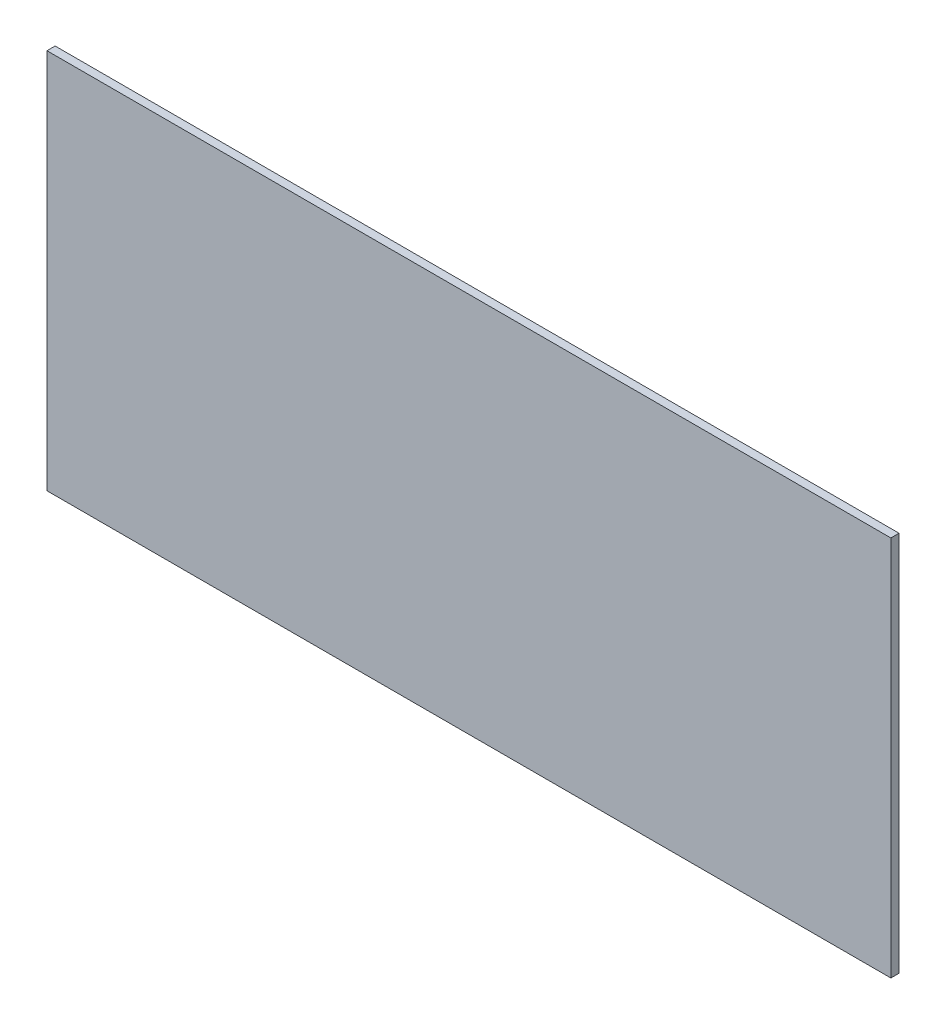
ISO-10303-21;
HEADER;
FILE_DESCRIPTION(('STEP AP214'),'2;1');
FILE_NAME('part.step','',(''),(''),'','','');
FILE_SCHEMA(('AUTOMOTIVE_DESIGN { 1 0 10303 214 1 1 1 1 }'));
ENDSEC;
DATA;
#1=APPLICATION_CONTEXT('core data for automotive mechanical design processes');
#2=APPLICATION_PROTOCOL_DEFINITION('international standard','automotive_design',2000,#1);
#3=PRODUCT_CONTEXT('',#1,'mechanical');
#4=PRODUCT('Part','Part','',(#3));
#5=PRODUCT_RELATED_PRODUCT_CATEGORY('part','',(#4));
#6=PRODUCT_DEFINITION_FORMATION('','',#4);
#7=PRODUCT_DEFINITION_CONTEXT('part definition',#1,'design');
#8=PRODUCT_DEFINITION('design','',#6,#7);
#9=PRODUCT_DEFINITION_SHAPE('','',#8);
#10=(LENGTH_UNIT() NAMED_UNIT(*) SI_UNIT(.MILLI.,.METRE.));
#11=(NAMED_UNIT(*) PLANE_ANGLE_UNIT() SI_UNIT($,.RADIAN.));
#12=(NAMED_UNIT(*) SI_UNIT($,.STERADIAN.) SOLID_ANGLE_UNIT());
#13=UNCERTAINTY_MEASURE_WITH_UNIT(LENGTH_MEASURE(1.E-05),#10,'distance_accuracy_value','');
#14=(GEOMETRIC_REPRESENTATION_CONTEXT(3) GLOBAL_UNCERTAINTY_ASSIGNED_CONTEXT((#13)) GLOBAL_UNIT_ASSIGNED_CONTEXT((#10,
#11,#12)) REPRESENTATION_CONTEXT('',''));
#15=CARTESIAN_POINT('',(0.,0.,0.));
#16=DIRECTION('',(0.,0.,1.));
#17=DIRECTION('',(1.,0.,0.));
#18=AXIS2_PLACEMENT_3D('',#15,#16,#17);
#19=CARTESIAN_POINT('',(155.,-70.,3.));
#20=DIRECTION('',(-1.,0.,0.));
#21=DIRECTION('',(0.,0.,1.));
#22=AXIS2_PLACEMENT_3D('',#19,#20,#21);
#23=PLANE('',#22);
#24=DIRECTION('',(0.,1.,0.));
#25=VECTOR('',#24,1.);
#26=CARTESIAN_POINT('',(155.,-70.,0.));
#27=LINE('',#26,#25);
#28=CARTESIAN_POINT('',(155.,-70.,0.));
#29=VERTEX_POINT('',#28);
#30=CARTESIAN_POINT('',(155.,70.,0.));
#31=VERTEX_POINT('',#30);
#32=EDGE_CURVE('E98',#29,#31,#27,.T.);
#33=ORIENTED_EDGE('',*,*,#32,.T.);
#34=DIRECTION('',(0.,0.,-1.));
#35=VECTOR('',#34,1.);
#36=CARTESIAN_POINT('',(155.,70.,3.));
#37=LINE('',#36,#35);
#38=CARTESIAN_POINT('',(155.,70.,3.));
#39=VERTEX_POINT('',#38);
#40=EDGE_CURVE('E11',#39,#31,#37,.T.);
#41=ORIENTED_EDGE('',*,*,#40,.F.);
#42=DIRECTION('',(0.,1.,0.));
#43=VECTOR('',#42,1.);
#44=CARTESIAN_POINT('',(155.,-70.,3.));
#45=LINE('',#44,#43);
#46=CARTESIAN_POINT('',(155.,-70.,3.));
#47=VERTEX_POINT('',#46);
#48=EDGE_CURVE('E86',#47,#39,#45,.T.);
#49=ORIENTED_EDGE('',*,*,#48,.F.);
#50=DIRECTION('',(0.,0.,-1.));
#51=VECTOR('',#50,1.);
#52=CARTESIAN_POINT('',(155.,-70.,3.));
#53=LINE('',#52,#51);
#54=EDGE_CURVE('E94',#47,#29,#53,.T.);
#55=ORIENTED_EDGE('',*,*,#54,.T.);
#56=EDGE_LOOP('',(#33,#41,#49,#55));
#57=FACE_BOUND('',#56,.T.);
#58=ADVANCED_FACE('F35',(#57),#23,.F.);
#59=CARTESIAN_POINT('',(-155.,70.,3.));
#60=DIRECTION('',(0.,-1.,0.));
#61=DIRECTION('',(0.,0.,-1.));
#62=AXIS2_PLACEMENT_3D('',#59,#60,#61);
#63=PLANE('',#62);
#64=DIRECTION('',(-1.,0.,0.));
#65=VECTOR('',#64,1.);
#66=CARTESIAN_POINT('',(-155.,70.,0.));
#67=LINE('',#66,#65);
#68=CARTESIAN_POINT('',(-155.,70.,0.));
#69=VERTEX_POINT('',#68);
#70=EDGE_CURVE('E90',#31,#69,#67,.T.);
#71=ORIENTED_EDGE('',*,*,#70,.T.);
#72=DIRECTION('',(0.,0.,-1.));
#73=VECTOR('',#72,1.);
#74=CARTESIAN_POINT('',(-155.,70.,3.));
#75=LINE('',#74,#73);
#76=CARTESIAN_POINT('',(-155.,70.,3.));
#77=VERTEX_POINT('',#76);
#78=EDGE_CURVE('E43',#77,#69,#75,.T.);
#79=ORIENTED_EDGE('',*,*,#78,.F.);
#80=DIRECTION('',(-1.,0.,0.));
#81=VECTOR('',#80,1.);
#82=CARTESIAN_POINT('',(-155.,70.,3.));
#83=LINE('',#82,#81);
#84=EDGE_CURVE('E81',#39,#77,#83,.T.);
#85=ORIENTED_EDGE('',*,*,#84,.F.);
#86=ORIENTED_EDGE('',*,*,#40,.T.);
#87=EDGE_LOOP('',(#71,#79,#85,#86));
#88=FACE_BOUND('',#87,.T.);
#89=ADVANCED_FACE('F89',(#88),#63,.F.);
#90=CARTESIAN_POINT('',(-155.,-70.,3.));
#91=DIRECTION('',(1.,0.,0.));
#92=DIRECTION('',(0.,0.,-1.));
#93=AXIS2_PLACEMENT_3D('',#90,#91,#92);
#94=PLANE('',#93);
#95=DIRECTION('',(0.,-1.,0.));
#96=VECTOR('',#95,1.);
#97=CARTESIAN_POINT('',(-155.,-70.,0.));
#98=LINE('',#97,#96);
#99=CARTESIAN_POINT('',(-155.,-70.,0.));
#100=VERTEX_POINT('',#99);
#101=EDGE_CURVE('E68',#69,#100,#98,.T.);
#102=ORIENTED_EDGE('',*,*,#101,.T.);
#103=DIRECTION('',(0.,0.,-1.));
#104=VECTOR('',#103,1.);
#105=CARTESIAN_POINT('',(-155.,-70.,3.));
#106=LINE('',#105,#104);
#107=CARTESIAN_POINT('',(-155.,-70.,3.));
#108=VERTEX_POINT('',#107);
#109=EDGE_CURVE('E91',#108,#100,#106,.T.);
#110=ORIENTED_EDGE('',*,*,#109,.F.);
#111=DIRECTION('',(0.,-1.,0.));
#112=VECTOR('',#111,1.);
#113=CARTESIAN_POINT('',(-155.,-70.,3.));
#114=LINE('',#113,#112);
#115=EDGE_CURVE('E84',#77,#108,#114,.T.);
#116=ORIENTED_EDGE('',*,*,#115,.F.);
#117=ORIENTED_EDGE('',*,*,#78,.T.);
#118=EDGE_LOOP('',(#102,#110,#116,#117));
#119=FACE_BOUND('',#118,.T.);
#120=ADVANCED_FACE('F92',(#119),#94,.F.);
#121=CARTESIAN_POINT('',(-155.,-70.,3.));
#122=DIRECTION('',(0.,1.,0.));
#123=DIRECTION('',(0.,0.,1.));
#124=AXIS2_PLACEMENT_3D('',#121,#122,#123);
#125=PLANE('',#124);
#126=DIRECTION('',(1.,0.,0.));
#127=VECTOR('',#126,1.);
#128=CARTESIAN_POINT('',(-155.,-70.,0.));
#129=LINE('',#128,#127);
#130=EDGE_CURVE('E74',#100,#29,#129,.T.);
#131=ORIENTED_EDGE('',*,*,#130,.T.);
#132=ORIENTED_EDGE('',*,*,#54,.F.);
#133=DIRECTION('',(1.,0.,0.));
#134=VECTOR('',#133,1.);
#135=CARTESIAN_POINT('',(-155.,-70.,3.));
#136=LINE('',#135,#134);
#137=EDGE_CURVE('E51',#108,#47,#136,.T.);
#138=ORIENTED_EDGE('',*,*,#137,.F.);
#139=ORIENTED_EDGE('',*,*,#109,.T.);
#140=EDGE_LOOP('',(#131,#132,#138,#139));
#141=FACE_BOUND('',#140,.T.);
#142=ADVANCED_FACE('F105',(#141),#125,.F.);
#143=CARTESIAN_POINT('',(0.,0.,3.));
#144=DIRECTION('',(0.,0.,-1.));
#145=DIRECTION('',(-1.,0.,0.));
#146=AXIS2_PLACEMENT_3D('',#143,#144,#145);
#147=PLANE('',#146);
#148=ORIENTED_EDGE('',*,*,#48,.T.);
#149=ORIENTED_EDGE('',*,*,#84,.T.);
#150=ORIENTED_EDGE('',*,*,#115,.T.);
#151=ORIENTED_EDGE('',*,*,#137,.T.);
#152=EDGE_LOOP('',(#148,#149,#150,#151));
#153=FACE_BOUND('',#152,.T.);
#154=ADVANCED_FACE('F82',(#153),#147,.F.);
#155=CARTESIAN_POINT('',(0.,0.,0.));
#156=DIRECTION('',(0.,0.,-1.));
#157=DIRECTION('',(-1.,0.,0.));
#158=AXIS2_PLACEMENT_3D('',#155,#156,#157);
#159=PLANE('',#158);
#160=ORIENTED_EDGE('',*,*,#32,.F.);
#161=ORIENTED_EDGE('',*,*,#130,.F.);
#162=ORIENTED_EDGE('',*,*,#101,.F.);
#163=ORIENTED_EDGE('',*,*,#70,.F.);
#164=EDGE_LOOP('',(#160,#161,#162,#163));
#165=FACE_BOUND('',#164,.T.);
#166=ADVANCED_FACE('F108',(#165),#159,.T.);
#167=CLOSED_SHELL('',(#58,#89,#120,#142,#154,#166));
#168=MANIFOLD_SOLID_BREP('B2',#167);
#169=ADVANCED_BREP_SHAPE_REPRESENTATION('',(#18,#168),#14);
#170=SHAPE_DEFINITION_REPRESENTATION(#9,#169);
ENDSEC;
END-ISO-10303-21;
